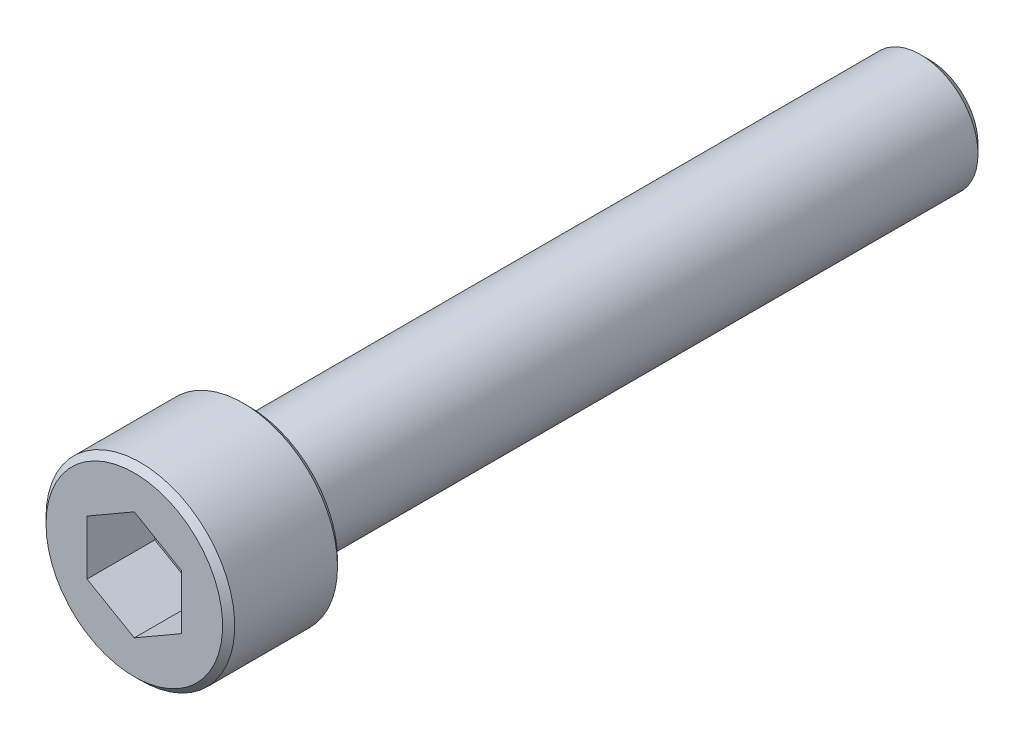
ISO-10303-21;
HEADER;
FILE_DESCRIPTION(('STEP AP214'),'2;1');
FILE_NAME('part.step','',(''),(''),'','','');
FILE_SCHEMA(('AUTOMOTIVE_DESIGN { 1 0 10303 214 1 1 1 1 }'));
ENDSEC;
DATA;
#1=APPLICATION_CONTEXT('core data for automotive mechanical design processes');
#2=APPLICATION_PROTOCOL_DEFINITION('international standard','automotive_design',2000,#1);
#3=PRODUCT_CONTEXT('',#1,'mechanical');
#4=PRODUCT('Part','Part','',(#3));
#5=PRODUCT_RELATED_PRODUCT_CATEGORY('part','',(#4));
#6=PRODUCT_DEFINITION_FORMATION('','',#4);
#7=PRODUCT_DEFINITION_CONTEXT('part definition',#1,'design');
#8=PRODUCT_DEFINITION('design','',#6,#7);
#9=PRODUCT_DEFINITION_SHAPE('','',#8);
#10=(LENGTH_UNIT() NAMED_UNIT(*) SI_UNIT(.MILLI.,.METRE.));
#11=(NAMED_UNIT(*) PLANE_ANGLE_UNIT() SI_UNIT($,.RADIAN.));
#12=(NAMED_UNIT(*) SI_UNIT($,.STERADIAN.) SOLID_ANGLE_UNIT());
#13=UNCERTAINTY_MEASURE_WITH_UNIT(LENGTH_MEASURE(1.E-05),#10,'distance_accuracy_value','');
#14=(GEOMETRIC_REPRESENTATION_CONTEXT(3) GLOBAL_UNCERTAINTY_ASSIGNED_CONTEXT((#13)) GLOBAL_UNIT_ASSIGNED_CONTEXT((#10,
#11,#12)) REPRESENTATION_CONTEXT('',''));
#15=CARTESIAN_POINT('',(0.,0.,0.));
#16=DIRECTION('',(0.,0.,1.));
#17=DIRECTION('',(1.,0.,0.));
#18=AXIS2_PLACEMENT_3D('',#15,#16,#17);
#19=CARTESIAN_POINT('',(0.,-2.29135888084633,1.9812));
#20=DIRECTION('',(0.,0.,-1.));
#21=DIRECTION('',(-1.,0.,0.));
#22=AXIS2_PLACEMENT_3D('',#19,#20,#21);
#23=PLANE('',#22);
#24=DIRECTION('',(0.,1.,0.));
#25=VECTOR('',#24,1.);
#26=CARTESIAN_POINT('',(1.984375,1.14567944042316,1.9812));
#27=LINE('',#26,#25);
#28=CARTESIAN_POINT('',(1.984375,-1.14567944042316,1.9812));
#29=VERTEX_POINT('',#28);
#30=CARTESIAN_POINT('',(1.984375,1.14567944042316,1.9812));
#31=VERTEX_POINT('',#30);
#32=EDGE_CURVE('E127',#29,#31,#27,.T.);
#33=ORIENTED_EDGE('',*,*,#32,.T.);
#34=DIRECTION('',(-0.866025403784439,0.5,0.));
#35=VECTOR('',#34,1.);
#36=CARTESIAN_POINT('',(0.,2.29135888084633,1.9812));
#37=LINE('',#36,#35);
#38=CARTESIAN_POINT('',(0.,2.29135888084633,1.9812));
#39=VERTEX_POINT('',#38);
#40=EDGE_CURVE('E132',#31,#39,#37,.T.);
#41=ORIENTED_EDGE('',*,*,#40,.T.);
#42=DIRECTION('',(-0.866025403784438,-0.500000000000001,0.));
#43=VECTOR('',#42,1.);
#44=CARTESIAN_POINT('',(-1.984375,1.14567944042316,1.9812));
#45=LINE('',#44,#43);
#46=CARTESIAN_POINT('',(-1.984375,1.14567944042316,1.9812));
#47=VERTEX_POINT('',#46);
#48=EDGE_CURVE('E136',#39,#47,#45,.T.);
#49=ORIENTED_EDGE('',*,*,#48,.T.);
#50=DIRECTION('',(0.,-1.,0.));
#51=VECTOR('',#50,1.);
#52=CARTESIAN_POINT('',(-1.984375,-1.14567944042316,1.9812));
#53=LINE('',#52,#51);
#54=CARTESIAN_POINT('',(-1.984375,-1.14567944042316,1.9812));
#55=VERTEX_POINT('',#54);
#56=EDGE_CURVE('E68',#47,#55,#53,.T.);
#57=ORIENTED_EDGE('',*,*,#56,.T.);
#58=DIRECTION('',(0.866025403784439,-0.5,0.));
#59=VECTOR('',#58,1.);
#60=CARTESIAN_POINT('',(0.,-2.29135888084633,1.9812));
#61=LINE('',#60,#59);
#62=CARTESIAN_POINT('',(0.,-2.29135888084633,1.9812));
#63=VERTEX_POINT('',#62);
#64=EDGE_CURVE('E70',#55,#63,#61,.T.);
#65=ORIENTED_EDGE('',*,*,#64,.T.);
#66=DIRECTION('',(0.866025403784439,0.5,0.));
#67=VECTOR('',#66,1.);
#68=CARTESIAN_POINT('',(1.984375,-1.14567944042316,1.9812));
#69=LINE('',#68,#67);
#70=EDGE_CURVE('E72',#63,#29,#69,.T.);
#71=ORIENTED_EDGE('',*,*,#70,.T.);
#72=EDGE_LOOP('',(#33,#41,#49,#57,#65,#71));
#73=FACE_BOUND('',#72,.T.);
#74=ADVANCED_FACE('F17',(#73),#23,.F.);
#75=CARTESIAN_POINT('',(1.984375,-1.14567944042316,1.9812));
#76=DIRECTION('',(0.5,-0.866025403784439,0.));
#77=DIRECTION('',(0.866025403784439,0.5,0.));
#78=AXIS2_PLACEMENT_3D('',#75,#76,#77);
#79=PLANE('',#78);
#80=DIRECTION('',(0.,0.,-1.));
#81=VECTOR('',#80,1.);
#82=CARTESIAN_POINT('',(1.984375,-1.14567944042316,1.9812));
#83=LINE('',#82,#81);
#84=CARTESIAN_POINT('',(1.984375,-1.14567944042316,4.826));
#85=VERTEX_POINT('',#84);
#86=EDGE_CURVE('E83',#85,#29,#83,.T.);
#87=ORIENTED_EDGE('',*,*,#86,.T.);
#88=ORIENTED_EDGE('',*,*,#70,.F.);
#89=DIRECTION('',(0.,0.,1.));
#90=VECTOR('',#89,1.);
#91=CARTESIAN_POINT('',(0.,-2.29135888084633,1.9812));
#92=LINE('',#91,#90);
#93=CARTESIAN_POINT('',(0.,-2.29135888084633,4.826));
#94=VERTEX_POINT('',#93);
#95=EDGE_CURVE('E77',#63,#94,#92,.T.);
#96=ORIENTED_EDGE('',*,*,#95,.T.);
#97=DIRECTION('',(-0.866025403784438,-0.5,0.));
#98=VECTOR('',#97,1.);
#99=CARTESIAN_POINT('',(1.984375,-1.14567944042316,4.826));
#100=LINE('',#99,#98);
#101=EDGE_CURVE('E124',#85,#94,#100,.T.);
#102=ORIENTED_EDGE('',*,*,#101,.F.);
#103=EDGE_LOOP('',(#87,#88,#96,#102));
#104=FACE_BOUND('',#103,.T.);
#105=ADVANCED_FACE('F80',(#104),#79,.F.);
#106=CARTESIAN_POINT('',(0.,-2.29135888084633,1.9812));
#107=DIRECTION('',(-0.5,-0.866025403784439,0.));
#108=DIRECTION('',(0.866025403784439,-0.5,0.));
#109=AXIS2_PLACEMENT_3D('',#106,#107,#108);
#110=PLANE('',#109);
#111=ORIENTED_EDGE('',*,*,#95,.F.);
#112=ORIENTED_EDGE('',*,*,#64,.F.);
#113=DIRECTION('',(0.,0.,1.));
#114=VECTOR('',#113,1.);
#115=CARTESIAN_POINT('',(-1.984375,-1.14567944042316,1.9812));
#116=LINE('',#115,#114);
#117=CARTESIAN_POINT('',(-1.984375,-1.14567944042316,4.826));
#118=VERTEX_POINT('',#117);
#119=EDGE_CURVE('E91',#55,#118,#116,.T.);
#120=ORIENTED_EDGE('',*,*,#119,.T.);
#121=DIRECTION('',(-0.866025403784439,0.5,0.));
#122=VECTOR('',#121,1.);
#123=CARTESIAN_POINT('',(0.,-2.29135888084633,4.826));
#124=LINE('',#123,#122);
#125=EDGE_CURVE('E88',#94,#118,#124,.T.);
#126=ORIENTED_EDGE('',*,*,#125,.F.);
#127=EDGE_LOOP('',(#111,#112,#120,#126));
#128=FACE_BOUND('',#127,.T.);
#129=ADVANCED_FACE('F86',(#128),#110,.F.);
#130=CARTESIAN_POINT('',(-1.984375,-1.14567944042316,1.9812));
#131=DIRECTION('',(-1.,0.,0.));
#132=DIRECTION('',(0.,-1.,0.));
#133=AXIS2_PLACEMENT_3D('',#130,#131,#132);
#134=PLANE('',#133);
#135=ORIENTED_EDGE('',*,*,#119,.F.);
#136=ORIENTED_EDGE('',*,*,#56,.F.);
#137=DIRECTION('',(0.,0.,1.));
#138=VECTOR('',#137,1.);
#139=CARTESIAN_POINT('',(-1.984375,1.14567944042316,1.9812));
#140=LINE('',#139,#138);
#141=CARTESIAN_POINT('',(-1.984375,1.14567944042316,4.826));
#142=VERTEX_POINT('',#141);
#143=EDGE_CURVE('E134',#47,#142,#140,.T.);
#144=ORIENTED_EDGE('',*,*,#143,.T.);
#145=DIRECTION('',(0.,1.,0.));
#146=VECTOR('',#145,1.);
#147=CARTESIAN_POINT('',(-1.984375,0.,4.826));
#148=LINE('',#147,#146);
#149=EDGE_CURVE('E120',#118,#142,#148,.T.);
#150=ORIENTED_EDGE('',*,*,#149,.F.);
#151=EDGE_LOOP('',(#135,#136,#144,#150));
#152=FACE_BOUND('',#151,.T.);
#153=ADVANCED_FACE('F139',(#152),#134,.F.);
#154=CARTESIAN_POINT('',(-1.984375,1.14567944042316,1.9812));
#155=DIRECTION('',(-0.500000000000001,0.866025403784438,0.));
#156=DIRECTION('',(-0.866025403784438,-0.500000000000001,0.));
#157=AXIS2_PLACEMENT_3D('',#154,#155,#156);
#158=PLANE('',#157);
#159=ORIENTED_EDGE('',*,*,#143,.F.);
#160=ORIENTED_EDGE('',*,*,#48,.F.);
#161=DIRECTION('',(0.,0.,1.));
#162=VECTOR('',#161,1.);
#163=CARTESIAN_POINT('',(0.,2.29135888084633,1.9812));
#164=LINE('',#163,#162);
#165=CARTESIAN_POINT('',(0.,2.29135888084633,4.826));
#166=VERTEX_POINT('',#165);
#167=EDGE_CURVE('E130',#39,#166,#164,.T.);
#168=ORIENTED_EDGE('',*,*,#167,.T.);
#169=DIRECTION('',(0.866025403784438,0.5,0.));
#170=VECTOR('',#169,1.);
#171=CARTESIAN_POINT('',(-1.984375,1.14567944042316,4.826));
#172=LINE('',#171,#170);
#173=EDGE_CURVE('E117',#142,#166,#172,.T.);
#174=ORIENTED_EDGE('',*,*,#173,.F.);
#175=EDGE_LOOP('',(#159,#160,#168,#174));
#176=FACE_BOUND('',#175,.T.);
#177=ADVANCED_FACE('F151',(#176),#158,.F.);
#178=CARTESIAN_POINT('',(0.,2.29135888084633,1.9812));
#179=DIRECTION('',(0.5,0.866025403784439,0.));
#180=DIRECTION('',(-0.866025403784439,0.5,0.));
#181=AXIS2_PLACEMENT_3D('',#178,#179,#180);
#182=PLANE('',#181);
#183=ORIENTED_EDGE('',*,*,#167,.F.);
#184=ORIENTED_EDGE('',*,*,#40,.F.);
#185=DIRECTION('',(0.,0.,-1.));
#186=VECTOR('',#185,1.);
#187=CARTESIAN_POINT('',(1.984375,1.14567944042316,1.9812));
#188=LINE('',#187,#186);
#189=CARTESIAN_POINT('',(1.984375,1.14567944042316,4.826));
#190=VERTEX_POINT('',#189);
#191=EDGE_CURVE('E35',#31,#190,#188,.F.);
#192=ORIENTED_EDGE('',*,*,#191,.T.);
#193=DIRECTION('',(0.866025403784439,-0.5,0.));
#194=VECTOR('',#193,1.);
#195=CARTESIAN_POINT('',(0.,2.29135888084633,4.826));
#196=LINE('',#195,#194);
#197=EDGE_CURVE('E114',#166,#190,#196,.T.);
#198=ORIENTED_EDGE('',*,*,#197,.F.);
#199=EDGE_LOOP('',(#183,#184,#192,#198));
#200=FACE_BOUND('',#199,.T.);
#201=ADVANCED_FACE('F149',(#200),#182,.F.);
#202=CARTESIAN_POINT('',(1.984375,1.14567944042316,1.9812));
#203=DIRECTION('',(1.,0.,0.));
#204=DIRECTION('',(0.,0.,-1.));
#205=AXIS2_PLACEMENT_3D('',#202,#203,#204);
#206=PLANE('',#205);
#207=ORIENTED_EDGE('',*,*,#191,.F.);
#208=ORIENTED_EDGE('',*,*,#32,.F.);
#209=ORIENTED_EDGE('',*,*,#86,.F.);
#210=DIRECTION('',(0.,1.,0.));
#211=VECTOR('',#210,1.);
#212=CARTESIAN_POINT('',(1.984375,0.,4.826));
#213=LINE('',#212,#211);
#214=EDGE_CURVE('E111',#190,#85,#213,.F.);
#215=ORIENTED_EDGE('',*,*,#214,.F.);
#216=EDGE_LOOP('',(#207,#208,#209,#215));
#217=FACE_BOUND('',#216,.T.);
#218=ADVANCED_FACE('F146',(#217),#206,.F.);
#219=CARTESIAN_POINT('',(0.,0.,4.826));
#220=DIRECTION('',(0.,0.,1.));
#221=DIRECTION('',(1.,0.,0.));
#222=AXIS2_PLACEMENT_3D('',#219,#220,#221);
#223=PLANE('',#222);
#224=ORIENTED_EDGE('',*,*,#197,.T.);
#225=ORIENTED_EDGE('',*,*,#214,.T.);
#226=ORIENTED_EDGE('',*,*,#101,.T.);
#227=ORIENTED_EDGE('',*,*,#125,.T.);
#228=ORIENTED_EDGE('',*,*,#149,.T.);
#229=ORIENTED_EDGE('',*,*,#173,.T.);
#230=EDGE_LOOP('',(#224,#225,#226,#227,#228,#229));
#231=FACE_BOUND('',#230,.T.);
#232=CARTESIAN_POINT('',(0.,0.,4.82599999998001));
#233=DIRECTION('',(0.,0.,-1.));
#234=DIRECTION('',(-1.,0.,0.));
#235=AXIS2_PLACEMENT_3D('',#232,#233,#234);
#236=CIRCLE('',#235,3.70839999993677);
#237=CARTESIAN_POINT('',(-3.70839999993677,0.,4.82599999998001));
#238=VERTEX_POINT('',#237);
#239=EDGE_CURVE('E20',#238,#238,#236,.T.);
#240=ORIENTED_EDGE('',*,*,#239,.F.);
#241=EDGE_LOOP('',(#240));
#242=FACE_BOUND('',#241,.T.);
#243=ADVANCED_FACE('F143',(#231,#242),#223,.T.);
#244=CARTESIAN_POINT('',(0.,0.,4.57200000010971));
#245=DIRECTION('',(0.,0.,-1.));
#246=DIRECTION('',(-1.,0.,0.));
#247=AXIS2_PLACEMENT_3D('',#244,#245,#246);
#248=CONICAL_SURFACE('',#247,3.96239999980708,0.785398163397448);
#249=ORIENTED_EDGE('',*,*,#239,.T.);
#250=EDGE_LOOP('',(#249));
#251=FACE_BOUND('',#250,.T.);
#252=CARTESIAN_POINT('',(0.,0.,4.57199999999999));
#253=DIRECTION('',(0.,0.,-1.));
#254=DIRECTION('',(-1.,0.,0.));
#255=AXIS2_PLACEMENT_3D('',#252,#253,#254);
#256=CIRCLE('',#255,3.9624);
#257=CARTESIAN_POINT('',(-3.9624,0.,4.57199999999999));
#258=VERTEX_POINT('',#257);
#259=EDGE_CURVE('E103',#258,#258,#256,.T.);
#260=ORIENTED_EDGE('',*,*,#259,.F.);
#261=EDGE_LOOP('',(#260));
#262=FACE_BOUND('',#261,.T.);
#263=ADVANCED_FACE('F188',(#251,#262),#248,.T.);
#264=CARTESIAN_POINT('',(0.,0.,4.826));
#265=DIRECTION('',(0.,0.,-1.));
#266=DIRECTION('',(-1.,0.,0.));
#267=AXIS2_PLACEMENT_3D('',#264,#265,#266);
#268=CYLINDRICAL_SURFACE('',#267,3.9624);
#269=ORIENTED_EDGE('',*,*,#259,.T.);
#270=EDGE_LOOP('',(#269));
#271=FACE_BOUND('',#270,.T.);
#272=CARTESIAN_POINT('',(0.,0.,0.253999999983989));
#273=DIRECTION('',(0.,0.,1.));
#274=DIRECTION('',(1.,0.,0.));
#275=AXIS2_PLACEMENT_3D('',#272,#273,#274);
#276=CIRCLE('',#275,3.96240000003445);
#277=CARTESIAN_POINT('',(3.96240000003445,0.,0.253999999983989));
#278=VERTEX_POINT('',#277);
#279=EDGE_CURVE('E99',#278,#278,#276,.F.);
#280=ORIENTED_EDGE('',*,*,#279,.F.);
#281=EDGE_LOOP('',(#280));
#282=FACE_BOUND('',#281,.T.);
#283=ADVANCED_FACE('F184',(#271,#282),#268,.T.);
#284=CARTESIAN_POINT('',(0.,0.,-28.575));
#285=DIRECTION('',(0.,0.,1.));
#286=DIRECTION('',(1.,0.,0.));
#287=AXIS2_PLACEMENT_3D('',#284,#285,#286);
#288=PLANE('',#287);
#289=CARTESIAN_POINT('',(0.,0.,-28.5749999999894));
#290=DIRECTION('',(0.,0.,1.));
#291=DIRECTION('',(1.,0.,0.));
#292=AXIS2_PLACEMENT_3D('',#289,#290,#291);
#293=CIRCLE('',#292,2.0319999999856);
#294=CARTESIAN_POINT('',(2.0319999999856,0.,-28.5749999999894));
#295=VERTEX_POINT('',#294);
#296=EDGE_CURVE('E97',#295,#295,#293,.T.);
#297=ORIENTED_EDGE('',*,*,#296,.F.);
#298=EDGE_LOOP('',(#297));
#299=FACE_BOUND('',#298,.T.);
#300=ADVANCED_FACE('F180',(#299),#288,.F.);
#301=CARTESIAN_POINT('',(0.,0.,0.253999999983989));
#302=DIRECTION('',(0.,0.,1.));
#303=DIRECTION('',(1.,0.,0.));
#304=AXIS2_PLACEMENT_3D('',#301,#302,#303);
#305=CONICAL_SURFACE('',#304,3.96240000003445,0.785398163397448);
#306=CARTESIAN_POINT('',(0.,0.,0.));
#307=DIRECTION('',(0.,0.,1.));
#308=DIRECTION('',(1.,0.,0.));
#309=AXIS2_PLACEMENT_3D('',#306,#307,#308);
#310=CIRCLE('',#309,3.70840000005046);
#311=CARTESIAN_POINT('',(3.70840000005046,0.,0.));
#312=VERTEX_POINT('',#311);
#313=EDGE_CURVE('E95',#312,#312,#310,.T.);
#314=ORIENTED_EDGE('',*,*,#313,.T.);
#315=EDGE_LOOP('',(#314));
#316=FACE_BOUND('',#315,.T.);
#317=ORIENTED_EDGE('',*,*,#279,.T.);
#318=EDGE_LOOP('',(#317));
#319=FACE_BOUND('',#318,.T.);
#320=ADVANCED_FACE('F176',(#316,#319),#305,.T.);
#321=CARTESIAN_POINT('',(0.,0.,-28.1940000000986));
#322=DIRECTION('',(0.,0.,1.));
#323=DIRECTION('',(1.,0.,0.));
#324=AXIS2_PLACEMENT_3D('',#321,#322,#323);
#325=CONICAL_SURFACE('',#324,2.41299999987632,0.785398163397448);
#326=CARTESIAN_POINT('',(0.,0.,-28.194));
#327=DIRECTION('',(0.,0.,1.));
#328=DIRECTION('',(1.,0.,0.));
#329=AXIS2_PLACEMENT_3D('',#326,#327,#328);
#330=CIRCLE('',#329,2.413);
#331=CARTESIAN_POINT('',(2.413,0.,-28.194));
#332=VERTEX_POINT('',#331);
#333=EDGE_CURVE('E26',#332,#332,#330,.T.);
#334=ORIENTED_EDGE('',*,*,#333,.F.);
#335=EDGE_LOOP('',(#334));
#336=FACE_BOUND('',#335,.T.);
#337=ORIENTED_EDGE('',*,*,#296,.T.);
#338=EDGE_LOOP('',(#337));
#339=FACE_BOUND('',#338,.T.);
#340=ADVANCED_FACE('F169',(#336,#339),#325,.T.);
#341=CARTESIAN_POINT('',(0.,0.,0.));
#342=DIRECTION('',(0.,0.,1.));
#343=DIRECTION('',(1.,0.,0.));
#344=AXIS2_PLACEMENT_3D('',#341,#342,#343);
#345=PLANE('',#344);
#346=CARTESIAN_POINT('',(0.,0.,0.));
#347=DIRECTION('',(0.,0.,1.));
#348=DIRECTION('',(1.,0.,0.));
#349=AXIS2_PLACEMENT_3D('',#346,#347,#348);
#350=CIRCLE('',#349,2.413);
#351=CARTESIAN_POINT('',(2.413,0.,0.));
#352=VERTEX_POINT('',#351);
#353=EDGE_CURVE('E11',#352,#352,#350,.F.);
#354=ORIENTED_EDGE('',*,*,#353,.F.);
#355=EDGE_LOOP('',(#354));
#356=FACE_BOUND('',#355,.T.);
#357=ORIENTED_EDGE('',*,*,#313,.F.);
#358=EDGE_LOOP('',(#357));
#359=FACE_BOUND('',#358,.T.);
#360=ADVANCED_FACE('F163',(#356,#359),#345,.F.);
#361=CARTESIAN_POINT('',(0.,0.,-28.575));
#362=DIRECTION('',(0.,0.,1.));
#363=DIRECTION('',(1.,0.,0.));
#364=AXIS2_PLACEMENT_3D('',#361,#362,#363);
#365=CYLINDRICAL_SURFACE('',#364,2.413);
#366=ORIENTED_EDGE('',*,*,#353,.T.);
#367=EDGE_LOOP('',(#366));
#368=FACE_BOUND('',#367,.T.);
#369=ORIENTED_EDGE('',*,*,#333,.T.);
#370=EDGE_LOOP('',(#369));
#371=FACE_BOUND('',#370,.T.);
#372=ADVANCED_FACE('F161',(#368,#371),#365,.T.);
#373=CLOSED_SHELL('',(#74,#105,#129,#153,#177,#201,#218,#243,#263,#283,#300,#320,#340,#360,#372));
#374=MANIFOLD_SOLID_BREP('B1',#373);
#375=ADVANCED_BREP_SHAPE_REPRESENTATION('',(#18,#374),#14);
#376=SHAPE_DEFINITION_REPRESENTATION(#9,#375);
ENDSEC;
END-ISO-10303-21;
